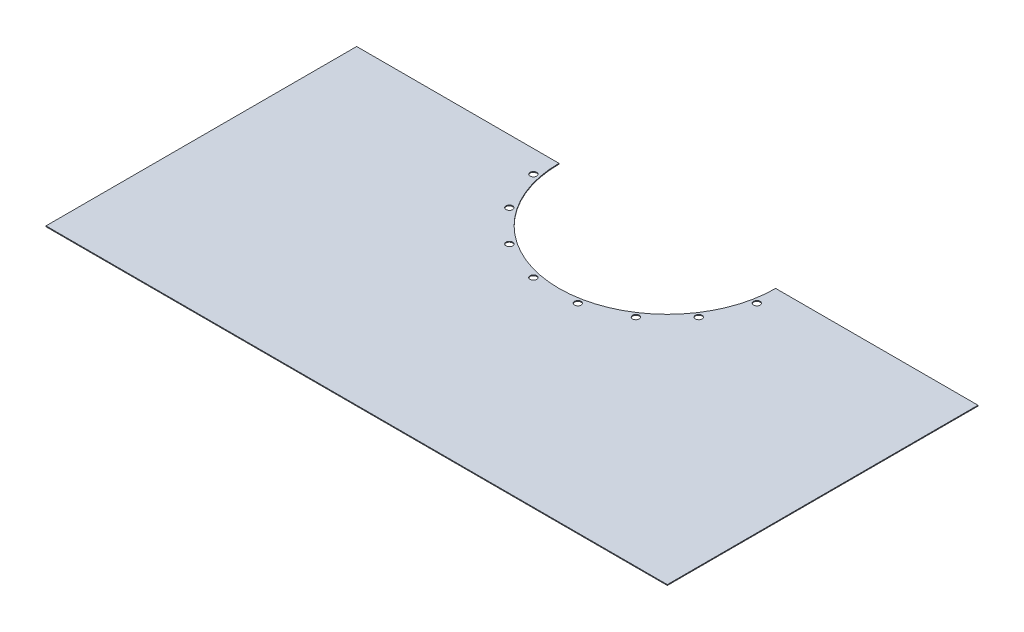
ISO-10303-21;
HEADER;
FILE_DESCRIPTION(('STEP AP214'),'2;1');
FILE_NAME('part.step','',(''),(''),'','','');
FILE_SCHEMA(('AUTOMOTIVE_DESIGN { 1 0 10303 214 1 1 1 1 }'));
ENDSEC;
DATA;
#1=APPLICATION_CONTEXT('core data for automotive mechanical design processes');
#2=APPLICATION_PROTOCOL_DEFINITION('international standard','automotive_design',2000,#1);
#3=PRODUCT_CONTEXT('',#1,'mechanical');
#4=PRODUCT('Part','Part','',(#3));
#5=PRODUCT_RELATED_PRODUCT_CATEGORY('part','',(#4));
#6=PRODUCT_DEFINITION_FORMATION('','',#4);
#7=PRODUCT_DEFINITION_CONTEXT('part definition',#1,'design');
#8=PRODUCT_DEFINITION('design','',#6,#7);
#9=PRODUCT_DEFINITION_SHAPE('','',#8);
#10=(LENGTH_UNIT() NAMED_UNIT(*) SI_UNIT(.MILLI.,.METRE.));
#11=(NAMED_UNIT(*) PLANE_ANGLE_UNIT() SI_UNIT($,.RADIAN.));
#12=(NAMED_UNIT(*) SI_UNIT($,.STERADIAN.) SOLID_ANGLE_UNIT());
#13=UNCERTAINTY_MEASURE_WITH_UNIT(LENGTH_MEASURE(1.E-05),#10,'distance_accuracy_value','');
#14=(GEOMETRIC_REPRESENTATION_CONTEXT(3) GLOBAL_UNCERTAINTY_ASSIGNED_CONTEXT((#13)) GLOBAL_UNIT_ASSIGNED_CONTEXT((#10,
#11,#12)) REPRESENTATION_CONTEXT('',''));
#15=CARTESIAN_POINT('',(0.,0.,0.));
#16=DIRECTION('',(0.,0.,1.));
#17=DIRECTION('',(1.,0.,0.));
#18=AXIS2_PLACEMENT_3D('',#15,#16,#17);
#19=CARTESIAN_POINT('',(0.,1.5875,0.));
#20=DIRECTION('',(0.,-1.,0.));
#21=DIRECTION('',(0.,0.,-1.));
#22=AXIS2_PLACEMENT_3D('',#19,#20,#21);
#23=CYLINDRICAL_SURFACE('',#22,212.625);
#24=CARTESIAN_POINT('',(0.,0.,0.));
#25=DIRECTION('',(0.,1.,0.));
#26=DIRECTION('',(0.,0.,1.));
#27=AXIS2_PLACEMENT_3D('',#24,#25,#26);
#28=CIRCLE('',#27,212.625);
#29=CARTESIAN_POINT('',(-212.625,0.,0.));
#30=VERTEX_POINT('',#29);
#31=CARTESIAN_POINT('',(212.625,0.,0.));
#32=VERTEX_POINT('',#31);
#33=EDGE_CURVE('E165',#30,#32,#28,.T.);
#34=ORIENTED_EDGE('',*,*,#33,.F.);
#35=DIRECTION('',(0.,-1.,0.));
#36=VECTOR('',#35,1.);
#37=CARTESIAN_POINT('',(-212.625,1.5875,0.));
#38=LINE('',#37,#36);
#39=CARTESIAN_POINT('',(-212.625,1.5875,0.));
#40=VERTEX_POINT('',#39);
#41=EDGE_CURVE('E11',#40,#30,#38,.T.);
#42=ORIENTED_EDGE('',*,*,#41,.F.);
#43=CARTESIAN_POINT('',(0.,1.5875,0.));
#44=DIRECTION('',(0.,1.,0.));
#45=DIRECTION('',(0.,0.,1.));
#46=AXIS2_PLACEMENT_3D('',#43,#44,#45);
#47=CIRCLE('',#46,212.625);
#48=CARTESIAN_POINT('',(212.625,1.5875,0.));
#49=VERTEX_POINT('',#48);
#50=EDGE_CURVE('E216',#40,#49,#47,.T.);
#51=ORIENTED_EDGE('',*,*,#50,.T.);
#52=DIRECTION('',(0.,-1.,0.));
#53=VECTOR('',#52,1.);
#54=CARTESIAN_POINT('',(212.625,1.5875,0.));
#55=LINE('',#54,#53);
#56=EDGE_CURVE('E62',#49,#32,#55,.T.);
#57=ORIENTED_EDGE('',*,*,#56,.T.);
#58=EDGE_LOOP('',(#34,#42,#51,#57));
#59=FACE_BOUND('',#58,.T.);
#60=ADVANCED_FACE('F45',(#59),#23,.F.);
#61=CARTESIAN_POINT('',(0.,1.5875,0.));
#62=DIRECTION('',(0.,0.,-1.));
#63=DIRECTION('',(-1.,0.,0.));
#64=AXIS2_PLACEMENT_3D('',#61,#62,#63);
#65=PLANE('',#64);
#66=DIRECTION('',(1.,0.,0.));
#67=VECTOR('',#66,1.);
#68=CARTESIAN_POINT('',(0.,0.,0.));
#69=LINE('',#68,#67);
#70=CARTESIAN_POINT('',(-609.6,0.,0.));
#71=VERTEX_POINT('',#70);
#72=EDGE_CURVE('E168',#71,#30,#69,.T.);
#73=ORIENTED_EDGE('',*,*,#72,.F.);
#74=DIRECTION('',(0.,-1.,0.));
#75=VECTOR('',#74,1.);
#76=CARTESIAN_POINT('',(-609.6,1.5875,0.));
#77=LINE('',#76,#75);
#78=CARTESIAN_POINT('',(-609.6,1.5875,0.));
#79=VERTEX_POINT('',#78);
#80=EDGE_CURVE('E54',#79,#71,#77,.T.);
#81=ORIENTED_EDGE('',*,*,#80,.F.);
#82=DIRECTION('',(1.,0.,0.));
#83=VECTOR('',#82,1.);
#84=CARTESIAN_POINT('',(0.,1.5875,0.));
#85=LINE('',#84,#83);
#86=EDGE_CURVE('E233',#79,#40,#85,.T.);
#87=ORIENTED_EDGE('',*,*,#86,.T.);
#88=ORIENTED_EDGE('',*,*,#41,.T.);
#89=EDGE_LOOP('',(#73,#81,#87,#88));
#90=FACE_BOUND('',#89,.T.);
#91=ADVANCED_FACE('F232',(#90),#65,.T.);
#92=CARTESIAN_POINT('',(-609.6,1.5875,1.11022302462516E-13));
#93=DIRECTION('',(1.,0.,0.));
#94=DIRECTION('',(0.,0.,-1.));
#95=AXIS2_PLACEMENT_3D('',#92,#93,#94);
#96=PLANE('',#95);
#97=DIRECTION('',(0.,0.,1.));
#98=VECTOR('',#97,1.);
#99=CARTESIAN_POINT('',(-609.6,0.,1.11022302462516E-13));
#100=LINE('',#99,#98);
#101=CARTESIAN_POINT('',(-609.6,0.,609.6));
#102=VERTEX_POINT('',#101);
#103=EDGE_CURVE('E172',#71,#102,#100,.T.);
#104=ORIENTED_EDGE('',*,*,#103,.T.);
#105=DIRECTION('',(0.,-1.,0.));
#106=VECTOR('',#105,1.);
#107=CARTESIAN_POINT('',(-609.6,1.5875,609.6));
#108=LINE('',#107,#106);
#109=CARTESIAN_POINT('',(-609.6,1.5875,609.6));
#110=VERTEX_POINT('',#109);
#111=EDGE_CURVE('E123',#110,#102,#108,.T.);
#112=ORIENTED_EDGE('',*,*,#111,.F.);
#113=DIRECTION('',(0.,0.,1.));
#114=VECTOR('',#113,1.);
#115=CARTESIAN_POINT('',(-609.6,1.5875,1.11022302462516E-13));
#116=LINE('',#115,#114);
#117=EDGE_CURVE('E109',#79,#110,#116,.T.);
#118=ORIENTED_EDGE('',*,*,#117,.F.);
#119=ORIENTED_EDGE('',*,*,#80,.T.);
#120=EDGE_LOOP('',(#104,#112,#118,#119));
#121=FACE_BOUND('',#120,.T.);
#122=ADVANCED_FACE('F225',(#121),#96,.F.);
#123=CARTESIAN_POINT('',(1.11022302462516E-13,1.5875,609.6));
#124=DIRECTION('',(0.,0.,-1.));
#125=DIRECTION('',(-1.,0.,0.));
#126=AXIS2_PLACEMENT_3D('',#123,#124,#125);
#127=PLANE('',#126);
#128=DIRECTION('',(1.,0.,0.));
#129=VECTOR('',#128,1.);
#130=CARTESIAN_POINT('',(1.11022302462516E-13,0.,609.6));
#131=LINE('',#130,#129);
#132=CARTESIAN_POINT('',(609.6,0.,609.6));
#133=VERTEX_POINT('',#132);
#134=EDGE_CURVE('E119',#102,#133,#131,.T.);
#135=ORIENTED_EDGE('',*,*,#134,.T.);
#136=DIRECTION('',(0.,-1.,0.));
#137=VECTOR('',#136,1.);
#138=CARTESIAN_POINT('',(609.6,1.5875,609.6));
#139=LINE('',#138,#137);
#140=CARTESIAN_POINT('',(609.6,1.5875,609.6));
#141=VERTEX_POINT('',#140);
#142=EDGE_CURVE('E116',#141,#133,#139,.T.);
#143=ORIENTED_EDGE('',*,*,#142,.F.);
#144=DIRECTION('',(1.,0.,0.));
#145=VECTOR('',#144,1.);
#146=CARTESIAN_POINT('',(1.11022302462516E-13,1.5875,609.6));
#147=LINE('',#146,#145);
#148=EDGE_CURVE('E100',#110,#141,#147,.T.);
#149=ORIENTED_EDGE('',*,*,#148,.F.);
#150=ORIENTED_EDGE('',*,*,#111,.T.);
#151=EDGE_LOOP('',(#135,#143,#149,#150));
#152=FACE_BOUND('',#151,.T.);
#153=ADVANCED_FACE('F117',(#152),#127,.F.);
#154=CARTESIAN_POINT('',(609.6,1.5875,1.11022302462516E-13));
#155=DIRECTION('',(-1.,0.,0.));
#156=DIRECTION('',(0.,0.,1.));
#157=AXIS2_PLACEMENT_3D('',#154,#155,#156);
#158=PLANE('',#157);
#159=DIRECTION('',(0.,0.,-1.));
#160=VECTOR('',#159,1.);
#161=CARTESIAN_POINT('',(609.6,0.,1.11022302462516E-13));
#162=LINE('',#161,#160);
#163=CARTESIAN_POINT('',(609.6,0.,0.));
#164=VERTEX_POINT('',#163);
#165=EDGE_CURVE('E177',#133,#164,#162,.T.);
#166=ORIENTED_EDGE('',*,*,#165,.T.);
#167=DIRECTION('',(0.,-1.,0.));
#168=VECTOR('',#167,1.);
#169=CARTESIAN_POINT('',(609.6,1.5875,0.));
#170=LINE('',#169,#168);
#171=CARTESIAN_POINT('',(609.6,1.5875,0.));
#172=VERTEX_POINT('',#171);
#173=EDGE_CURVE('E82',#172,#164,#170,.T.);
#174=ORIENTED_EDGE('',*,*,#173,.F.);
#175=DIRECTION('',(0.,0.,-1.));
#176=VECTOR('',#175,1.);
#177=CARTESIAN_POINT('',(609.6,1.5875,1.11022302462516E-13));
#178=LINE('',#177,#176);
#179=EDGE_CURVE('E106',#141,#172,#178,.T.);
#180=ORIENTED_EDGE('',*,*,#179,.F.);
#181=ORIENTED_EDGE('',*,*,#142,.T.);
#182=EDGE_LOOP('',(#166,#174,#180,#181));
#183=FACE_BOUND('',#182,.T.);
#184=ADVANCED_FACE('F125',(#183),#158,.F.);
#185=CARTESIAN_POINT('',(185.833458349619,1.5875,124.169947079881));
#186=DIRECTION('',(0.,-1.,0.));
#187=DIRECTION('',(0.,0.,-1.));
#188=AXIS2_PLACEMENT_3D('',#185,#186,#187);
#189=CYLINDRICAL_SURFACE('',#188,6.50000000000002);
#190=CARTESIAN_POINT('',(185.833458349619,1.5875,124.169947079881));
#191=DIRECTION('',(0.,1.,0.));
#192=DIRECTION('',(0.,0.,1.));
#193=AXIS2_PLACEMENT_3D('',#190,#191,#192);
#194=CIRCLE('',#193,6.50000000000002);
#195=CARTESIAN_POINT('',(185.833458349619,1.5875,130.669947079881));
#196=VERTEX_POINT('',#195);
#197=EDGE_CURVE('E157',#196,#196,#194,.T.);
#198=ORIENTED_EDGE('',*,*,#197,.T.);
#199=EDGE_LOOP('',(#198));
#200=FACE_BOUND('',#199,.T.);
#201=CARTESIAN_POINT('',(185.833458349619,0.,124.169947079881));
#202=DIRECTION('',(0.,1.,0.));
#203=DIRECTION('',(0.,0.,1.));
#204=AXIS2_PLACEMENT_3D('',#201,#202,#203);
#205=CIRCLE('',#204,6.50000000000002);
#206=CARTESIAN_POINT('',(185.833458349619,0.,130.669947079881));
#207=VERTEX_POINT('',#206);
#208=EDGE_CURVE('E208',#207,#207,#205,.T.);
#209=ORIENTED_EDGE('',*,*,#208,.F.);
#210=EDGE_LOOP('',(#209));
#211=FACE_BOUND('',#210,.T.);
#212=ADVANCED_FACE('F260',(#200,#211),#189,.F.);
#213=CARTESIAN_POINT('',(124.169947079881,1.5875,185.833458349619));
#214=DIRECTION('',(0.,-1.,0.));
#215=DIRECTION('',(0.,0.,-1.));
#216=AXIS2_PLACEMENT_3D('',#213,#214,#215);
#217=CYLINDRICAL_SURFACE('',#216,6.50000000000006);
#218=CARTESIAN_POINT('',(124.169947079881,1.5875,185.833458349619));
#219=DIRECTION('',(0.,1.,0.));
#220=DIRECTION('',(0.,0.,1.));
#221=AXIS2_PLACEMENT_3D('',#218,#219,#220);
#222=CIRCLE('',#221,6.50000000000006);
#223=CARTESIAN_POINT('',(124.169947079881,1.5875,192.333458349619));
#224=VERTEX_POINT('',#223);
#225=EDGE_CURVE('E153',#224,#224,#222,.T.);
#226=ORIENTED_EDGE('',*,*,#225,.T.);
#227=EDGE_LOOP('',(#226));
#228=FACE_BOUND('',#227,.T.);
#229=CARTESIAN_POINT('',(124.169947079881,0.,185.833458349619));
#230=DIRECTION('',(0.,1.,0.));
#231=DIRECTION('',(0.,0.,1.));
#232=AXIS2_PLACEMENT_3D('',#229,#230,#231);
#233=CIRCLE('',#232,6.50000000000006);
#234=CARTESIAN_POINT('',(124.169947079881,0.,192.333458349619));
#235=VERTEX_POINT('',#234);
#236=EDGE_CURVE('E204',#235,#235,#233,.T.);
#237=ORIENTED_EDGE('',*,*,#236,.F.);
#238=EDGE_LOOP('',(#237));
#239=FACE_BOUND('',#238,.T.);
#240=ADVANCED_FACE('F264',(#228,#239),#217,.F.);
#241=CARTESIAN_POINT('',(43.6026869706046,1.5875,219.205510170122));
#242=DIRECTION('',(0.,-1.,0.));
#243=DIRECTION('',(0.,0.,-1.));
#244=AXIS2_PLACEMENT_3D('',#241,#242,#243);
#245=CYLINDRICAL_SURFACE('',#244,6.50000000000001);
#246=CARTESIAN_POINT('',(43.6026869706046,1.5875,219.205510170122));
#247=DIRECTION('',(0.,1.,0.));
#248=DIRECTION('',(0.,0.,1.));
#249=AXIS2_PLACEMENT_3D('',#246,#247,#248);
#250=CIRCLE('',#249,6.50000000000001);
#251=CARTESIAN_POINT('',(43.6026869706046,1.5875,225.705510170122));
#252=VERTEX_POINT('',#251);
#253=EDGE_CURVE('E149',#252,#252,#250,.T.);
#254=ORIENTED_EDGE('',*,*,#253,.T.);
#255=EDGE_LOOP('',(#254));
#256=FACE_BOUND('',#255,.T.);
#257=CARTESIAN_POINT('',(43.6026869706046,0.,219.205510170122));
#258=DIRECTION('',(0.,1.,0.));
#259=DIRECTION('',(0.,0.,1.));
#260=AXIS2_PLACEMENT_3D('',#257,#258,#259);
#261=CIRCLE('',#260,6.50000000000001);
#262=CARTESIAN_POINT('',(43.6026869706046,0.,225.705510170122));
#263=VERTEX_POINT('',#262);
#264=EDGE_CURVE('E200',#263,#263,#261,.T.);
#265=ORIENTED_EDGE('',*,*,#264,.F.);
#266=EDGE_LOOP('',(#265));
#267=FACE_BOUND('',#266,.T.);
#268=ADVANCED_FACE('F270',(#256,#267),#245,.F.);
#269=CARTESIAN_POINT('',(-43.6026869706047,1.5875,219.205510170122));
#270=DIRECTION('',(0.,-1.,0.));
#271=DIRECTION('',(0.,0.,-1.));
#272=AXIS2_PLACEMENT_3D('',#269,#270,#271);
#273=CYLINDRICAL_SURFACE('',#272,6.50000000000002);
#274=CARTESIAN_POINT('',(-43.6026869706047,1.5875,219.205510170122));
#275=DIRECTION('',(0.,1.,0.));
#276=DIRECTION('',(0.,0.,1.));
#277=AXIS2_PLACEMENT_3D('',#274,#275,#276);
#278=CIRCLE('',#277,6.50000000000002);
#279=CARTESIAN_POINT('',(-43.6026869706047,1.5875,225.705510170122));
#280=VERTEX_POINT('',#279);
#281=EDGE_CURVE('E145',#280,#280,#278,.T.);
#282=ORIENTED_EDGE('',*,*,#281,.T.);
#283=EDGE_LOOP('',(#282));
#284=FACE_BOUND('',#283,.T.);
#285=CARTESIAN_POINT('',(-43.6026869706047,0.,219.205510170122));
#286=DIRECTION('',(0.,1.,0.));
#287=DIRECTION('',(0.,0.,1.));
#288=AXIS2_PLACEMENT_3D('',#285,#286,#287);
#289=CIRCLE('',#288,6.50000000000002);
#290=CARTESIAN_POINT('',(-43.6026869706047,0.,225.705510170122));
#291=VERTEX_POINT('',#290);
#292=EDGE_CURVE('E196',#291,#291,#289,.T.);
#293=ORIENTED_EDGE('',*,*,#292,.F.);
#294=EDGE_LOOP('',(#293));
#295=FACE_BOUND('',#294,.T.);
#296=ADVANCED_FACE('F278',(#284,#295),#273,.F.);
#297=CARTESIAN_POINT('',(-124.169947079881,1.5875,185.833458349619));
#298=DIRECTION('',(0.,-1.,0.));
#299=DIRECTION('',(0.,0.,-1.));
#300=AXIS2_PLACEMENT_3D('',#297,#298,#299);
#301=CYLINDRICAL_SURFACE('',#300,6.50000000000002);
#302=CARTESIAN_POINT('',(-124.169947079881,1.5875,185.833458349619));
#303=DIRECTION('',(0.,1.,0.));
#304=DIRECTION('',(0.,0.,1.));
#305=AXIS2_PLACEMENT_3D('',#302,#303,#304);
#306=CIRCLE('',#305,6.50000000000002);
#307=CARTESIAN_POINT('',(-124.169947079881,1.5875,192.333458349619));
#308=VERTEX_POINT('',#307);
#309=EDGE_CURVE('E141',#308,#308,#306,.T.);
#310=ORIENTED_EDGE('',*,*,#309,.T.);
#311=EDGE_LOOP('',(#310));
#312=FACE_BOUND('',#311,.T.);
#313=CARTESIAN_POINT('',(-124.169947079881,0.,185.833458349619));
#314=DIRECTION('',(0.,1.,0.));
#315=DIRECTION('',(0.,0.,1.));
#316=AXIS2_PLACEMENT_3D('',#313,#314,#315);
#317=CIRCLE('',#316,6.50000000000002);
#318=CARTESIAN_POINT('',(-124.169947079881,0.,192.333458349619));
#319=VERTEX_POINT('',#318);
#320=EDGE_CURVE('E192',#319,#319,#317,.T.);
#321=ORIENTED_EDGE('',*,*,#320,.F.);
#322=EDGE_LOOP('',(#321));
#323=FACE_BOUND('',#322,.T.);
#324=ADVANCED_FACE('F282',(#312,#323),#301,.F.);
#325=CARTESIAN_POINT('',(-185.833458349619,1.5875,124.169947079881));
#326=DIRECTION('',(0.,-1.,0.));
#327=DIRECTION('',(0.,0.,-1.));
#328=AXIS2_PLACEMENT_3D('',#325,#326,#327);
#329=CYLINDRICAL_SURFACE('',#328,6.50000000000004);
#330=CARTESIAN_POINT('',(-185.833458349619,1.5875,124.169947079881));
#331=DIRECTION('',(0.,1.,0.));
#332=DIRECTION('',(0.,0.,1.));
#333=AXIS2_PLACEMENT_3D('',#330,#331,#332);
#334=CIRCLE('',#333,6.50000000000004);
#335=CARTESIAN_POINT('',(-185.833458349619,1.5875,130.669947079881));
#336=VERTEX_POINT('',#335);
#337=EDGE_CURVE('E137',#336,#336,#334,.T.);
#338=ORIENTED_EDGE('',*,*,#337,.T.);
#339=EDGE_LOOP('',(#338));
#340=FACE_BOUND('',#339,.T.);
#341=CARTESIAN_POINT('',(-185.833458349619,0.,124.169947079881));
#342=DIRECTION('',(0.,1.,0.));
#343=DIRECTION('',(0.,0.,1.));
#344=AXIS2_PLACEMENT_3D('',#341,#342,#343);
#345=CIRCLE('',#344,6.50000000000004);
#346=CARTESIAN_POINT('',(-185.833458349619,0.,130.669947079881));
#347=VERTEX_POINT('',#346);
#348=EDGE_CURVE('E188',#347,#347,#345,.T.);
#349=ORIENTED_EDGE('',*,*,#348,.F.);
#350=EDGE_LOOP('',(#349));
#351=FACE_BOUND('',#350,.T.);
#352=ADVANCED_FACE('F245',(#340,#351),#329,.F.);
#353=CARTESIAN_POINT('',(-219.205510170122,1.5875,43.6026869706046));
#354=DIRECTION('',(0.,-1.,0.));
#355=DIRECTION('',(0.,0.,-1.));
#356=AXIS2_PLACEMENT_3D('',#353,#354,#355);
#357=CYLINDRICAL_SURFACE('',#356,6.50000000000004);
#358=CARTESIAN_POINT('',(-219.205510170122,1.5875,43.6026869706046));
#359=DIRECTION('',(0.,1.,0.));
#360=DIRECTION('',(0.,0.,1.));
#361=AXIS2_PLACEMENT_3D('',#358,#359,#360);
#362=CIRCLE('',#361,6.50000000000004);
#363=CARTESIAN_POINT('',(-219.205510170122,1.5875,50.1026869706047));
#364=VERTEX_POINT('',#363);
#365=EDGE_CURVE('E130',#364,#364,#362,.T.);
#366=ORIENTED_EDGE('',*,*,#365,.T.);
#367=EDGE_LOOP('',(#366));
#368=FACE_BOUND('',#367,.T.);
#369=CARTESIAN_POINT('',(-219.205510170122,0.,43.6026869706046));
#370=DIRECTION('',(0.,1.,0.));
#371=DIRECTION('',(0.,0.,1.));
#372=AXIS2_PLACEMENT_3D('',#369,#370,#371);
#373=CIRCLE('',#372,6.50000000000004);
#374=CARTESIAN_POINT('',(-219.205510170122,0.,50.1026869706047));
#375=VERTEX_POINT('',#374);
#376=EDGE_CURVE('E184',#375,#375,#373,.T.);
#377=ORIENTED_EDGE('',*,*,#376,.F.);
#378=EDGE_LOOP('',(#377));
#379=FACE_BOUND('',#378,.T.);
#380=ADVANCED_FACE('F237',(#368,#379),#357,.F.);
#381=CARTESIAN_POINT('',(0.,1.5875,0.));
#382=DIRECTION('',(0.,0.,-1.));
#383=DIRECTION('',(-1.,0.,0.));
#384=AXIS2_PLACEMENT_3D('',#381,#382,#383);
#385=PLANE('',#384);
#386=DIRECTION('',(1.,0.,0.));
#387=VECTOR('',#386,1.);
#388=CARTESIAN_POINT('',(0.,0.,0.));
#389=LINE('',#388,#387);
#390=EDGE_CURVE('E180',#32,#164,#389,.T.);
#391=ORIENTED_EDGE('',*,*,#390,.F.);
#392=ORIENTED_EDGE('',*,*,#56,.F.);
#393=DIRECTION('',(1.,0.,0.));
#394=VECTOR('',#393,1.);
#395=CARTESIAN_POINT('',(0.,1.5875,0.));
#396=LINE('',#395,#394);
#397=EDGE_CURVE('E127',#49,#172,#396,.T.);
#398=ORIENTED_EDGE('',*,*,#397,.T.);
#399=ORIENTED_EDGE('',*,*,#173,.T.);
#400=EDGE_LOOP('',(#391,#392,#398,#399));
#401=FACE_BOUND('',#400,.T.);
#402=ADVANCED_FACE('F234',(#401),#385,.T.);
#403=CARTESIAN_POINT('',(219.205510170122,1.5875,43.6026869706046));
#404=DIRECTION('',(0.,-1.,0.));
#405=DIRECTION('',(0.,0.,-1.));
#406=AXIS2_PLACEMENT_3D('',#403,#404,#405);
#407=CYLINDRICAL_SURFACE('',#406,6.50000000000001);
#408=CARTESIAN_POINT('',(219.205510170122,1.5875,43.6026869706046));
#409=DIRECTION('',(0.,1.,0.));
#410=DIRECTION('',(0.,0.,1.));
#411=AXIS2_PLACEMENT_3D('',#408,#409,#410);
#412=CIRCLE('',#411,6.50000000000001);
#413=CARTESIAN_POINT('',(219.205510170122,1.5875,50.1026869706046));
#414=VERTEX_POINT('',#413);
#415=EDGE_CURVE('E161',#414,#414,#412,.T.);
#416=ORIENTED_EDGE('',*,*,#415,.T.);
#417=EDGE_LOOP('',(#416));
#418=FACE_BOUND('',#417,.T.);
#419=CARTESIAN_POINT('',(219.205510170122,0.,43.6026869706046));
#420=DIRECTION('',(0.,1.,0.));
#421=DIRECTION('',(0.,0.,1.));
#422=AXIS2_PLACEMENT_3D('',#419,#420,#421);
#423=CIRCLE('',#422,6.50000000000001);
#424=CARTESIAN_POINT('',(219.205510170122,0.,50.1026869706046));
#425=VERTEX_POINT('',#424);
#426=EDGE_CURVE('E212',#425,#425,#423,.T.);
#427=ORIENTED_EDGE('',*,*,#426,.F.);
#428=EDGE_LOOP('',(#427));
#429=FACE_BOUND('',#428,.T.);
#430=ADVANCED_FACE('F236',(#418,#429),#407,.F.);
#431=CARTESIAN_POINT('',(0.,1.5875,0.));
#432=DIRECTION('',(0.,1.,0.));
#433=DIRECTION('',(0.,0.,1.));
#434=AXIS2_PLACEMENT_3D('',#431,#432,#433);
#435=PLANE('',#434);
#436=ORIENTED_EDGE('',*,*,#50,.F.);
#437=ORIENTED_EDGE('',*,*,#86,.F.);
#438=ORIENTED_EDGE('',*,*,#117,.T.);
#439=ORIENTED_EDGE('',*,*,#148,.T.);
#440=ORIENTED_EDGE('',*,*,#179,.T.);
#441=ORIENTED_EDGE('',*,*,#397,.F.);
#442=EDGE_LOOP('',(#436,#437,#438,#439,#440,#441));
#443=FACE_BOUND('',#442,.T.);
#444=ORIENTED_EDGE('',*,*,#365,.F.);
#445=EDGE_LOOP('',(#444));
#446=FACE_BOUND('',#445,.T.);
#447=ORIENTED_EDGE('',*,*,#337,.F.);
#448=EDGE_LOOP('',(#447));
#449=FACE_BOUND('',#448,.T.);
#450=ORIENTED_EDGE('',*,*,#309,.F.);
#451=EDGE_LOOP('',(#450));
#452=FACE_BOUND('',#451,.T.);
#453=ORIENTED_EDGE('',*,*,#281,.F.);
#454=EDGE_LOOP('',(#453));
#455=FACE_BOUND('',#454,.T.);
#456=ORIENTED_EDGE('',*,*,#253,.F.);
#457=EDGE_LOOP('',(#456));
#458=FACE_BOUND('',#457,.T.);
#459=ORIENTED_EDGE('',*,*,#225,.F.);
#460=EDGE_LOOP('',(#459));
#461=FACE_BOUND('',#460,.T.);
#462=ORIENTED_EDGE('',*,*,#197,.F.);
#463=EDGE_LOOP('',(#462));
#464=FACE_BOUND('',#463,.T.);
#465=ORIENTED_EDGE('',*,*,#415,.F.);
#466=EDGE_LOOP('',(#465));
#467=FACE_BOUND('',#466,.T.);
#468=ADVANCED_FACE('F102',(#443,#446,#449,#452,#455,#458,#461,#464,#467),#435,.T.);
#469=CARTESIAN_POINT('',(0.,0.,0.));
#470=DIRECTION('',(0.,1.,0.));
#471=DIRECTION('',(0.,0.,1.));
#472=AXIS2_PLACEMENT_3D('',#469,#470,#471);
#473=PLANE('',#472);
#474=ORIENTED_EDGE('',*,*,#33,.T.);
#475=ORIENTED_EDGE('',*,*,#390,.T.);
#476=ORIENTED_EDGE('',*,*,#165,.F.);
#477=ORIENTED_EDGE('',*,*,#134,.F.);
#478=ORIENTED_EDGE('',*,*,#103,.F.);
#479=ORIENTED_EDGE('',*,*,#72,.T.);
#480=EDGE_LOOP('',(#474,#475,#476,#477,#478,#479));
#481=FACE_BOUND('',#480,.T.);
#482=ORIENTED_EDGE('',*,*,#376,.T.);
#483=EDGE_LOOP('',(#482));
#484=FACE_BOUND('',#483,.T.);
#485=ORIENTED_EDGE('',*,*,#348,.T.);
#486=EDGE_LOOP('',(#485));
#487=FACE_BOUND('',#486,.T.);
#488=ORIENTED_EDGE('',*,*,#320,.T.);
#489=EDGE_LOOP('',(#488));
#490=FACE_BOUND('',#489,.T.);
#491=ORIENTED_EDGE('',*,*,#292,.T.);
#492=EDGE_LOOP('',(#491));
#493=FACE_BOUND('',#492,.T.);
#494=ORIENTED_EDGE('',*,*,#264,.T.);
#495=EDGE_LOOP('',(#494));
#496=FACE_BOUND('',#495,.T.);
#497=ORIENTED_EDGE('',*,*,#236,.T.);
#498=EDGE_LOOP('',(#497));
#499=FACE_BOUND('',#498,.T.);
#500=ORIENTED_EDGE('',*,*,#208,.T.);
#501=EDGE_LOOP('',(#500));
#502=FACE_BOUND('',#501,.T.);
#503=ORIENTED_EDGE('',*,*,#426,.T.);
#504=EDGE_LOOP('',(#503));
#505=FACE_BOUND('',#504,.T.);
#506=ADVANCED_FACE('F230',(#481,#484,#487,#490,#493,#496,#499,#502,#505),#473,.F.);
#507=CLOSED_SHELL('',(#60,#91,#122,#153,#184,#212,#240,#268,#296,#324,#352,#380,#402,#430,#468,#506));
#508=MANIFOLD_SOLID_BREP('B2',#507);
#509=ADVANCED_BREP_SHAPE_REPRESENTATION('',(#18,#508),#14);
#510=SHAPE_DEFINITION_REPRESENTATION(#9,#509);
ENDSEC;
END-ISO-10303-21;
